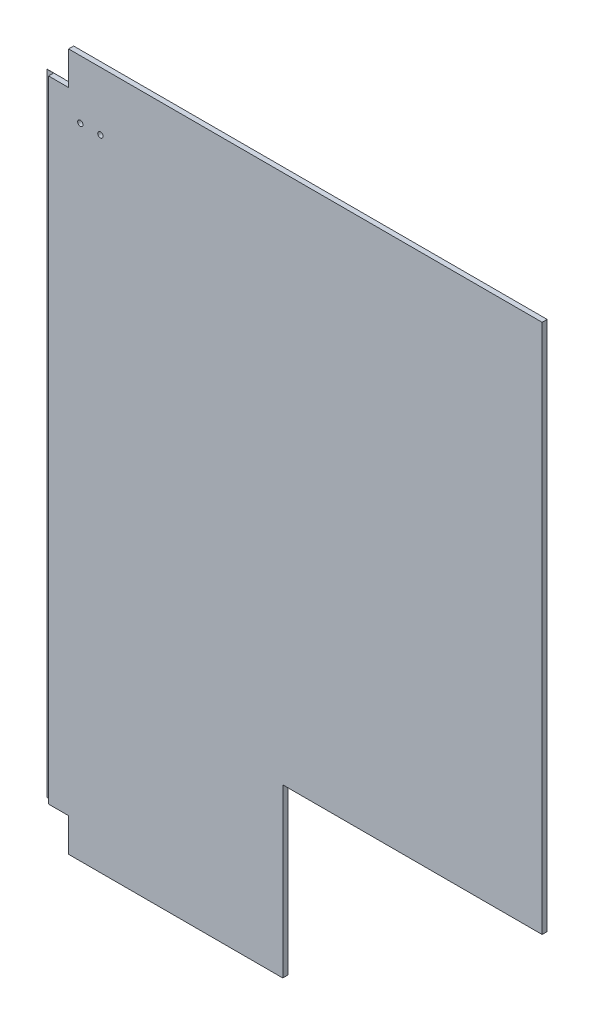
ISO-10303-21;
HEADER;
FILE_DESCRIPTION(('STEP AP214'),'2;1');
FILE_NAME('part.step','',(''),(''),'','','');
FILE_SCHEMA(('AUTOMOTIVE_DESIGN { 1 0 10303 214 1 1 1 1 }'));
ENDSEC;
DATA;
#1=APPLICATION_CONTEXT('core data for automotive mechanical design processes');
#2=APPLICATION_PROTOCOL_DEFINITION('international standard','automotive_design',2000,#1);
#3=PRODUCT_CONTEXT('',#1,'mechanical');
#4=PRODUCT('Part','Part','',(#3));
#5=PRODUCT_RELATED_PRODUCT_CATEGORY('part','',(#4));
#6=PRODUCT_DEFINITION_FORMATION('','',#4);
#7=PRODUCT_DEFINITION_CONTEXT('part definition',#1,'design');
#8=PRODUCT_DEFINITION('design','',#6,#7);
#9=PRODUCT_DEFINITION_SHAPE('','',#8);
#10=(LENGTH_UNIT() NAMED_UNIT(*) SI_UNIT(.MILLI.,.METRE.));
#11=(NAMED_UNIT(*) PLANE_ANGLE_UNIT() SI_UNIT($,.RADIAN.));
#12=(NAMED_UNIT(*) SI_UNIT($,.STERADIAN.) SOLID_ANGLE_UNIT());
#13=UNCERTAINTY_MEASURE_WITH_UNIT(LENGTH_MEASURE(1.E-05),#10,'distance_accuracy_value','');
#14=(GEOMETRIC_REPRESENTATION_CONTEXT(3) GLOBAL_UNCERTAINTY_ASSIGNED_CONTEXT((#13)) GLOBAL_UNIT_ASSIGNED_CONTEXT((#10,
#11,#12)) REPRESENTATION_CONTEXT('',''));
#15=CARTESIAN_POINT('',(0.,0.,0.));
#16=DIRECTION('',(0.,0.,1.));
#17=DIRECTION('',(1.,0.,0.));
#18=AXIS2_PLACEMENT_3D('',#15,#16,#17);
#19=CARTESIAN_POINT('',(5.99999999999989,416.9,-0.1));
#20=DIRECTION('',(1.,0.,0.));
#21=DIRECTION('',(0.,1.,0.));
#22=AXIS2_PLACEMENT_3D('',#19,#20,#21);
#23=PLANE('',#22);
#24=DIRECTION('',(0.,0.,-1.));
#25=VECTOR('',#24,1.);
#26=CARTESIAN_POINT('',(5.99999999999989,396.9,-0.1));
#27=LINE('',#26,#25);
#28=CARTESIAN_POINT('',(5.99999999999994,396.9,0.));
#29=VERTEX_POINT('',#28);
#30=CARTESIAN_POINT('',(5.99999999999989,396.9,-0.1));
#31=VERTEX_POINT('',#30);
#32=EDGE_CURVE('E109',#29,#31,#27,.T.);
#33=ORIENTED_EDGE('',*,*,#32,.F.);
#34=DIRECTION('',(0.,1.,0.));
#35=VECTOR('',#34,1.);
#36=CARTESIAN_POINT('',(5.99999999999989,416.9,0.));
#37=LINE('',#36,#35);
#38=CARTESIAN_POINT('',(5.99999999999993,20.,0.));
#39=VERTEX_POINT('',#38);
#40=EDGE_CURVE('E117',#39,#29,#37,.T.);
#41=ORIENTED_EDGE('',*,*,#40,.F.);
#42=DIRECTION('',(0.,0.,1.));
#43=VECTOR('',#42,1.);
#44=CARTESIAN_POINT('',(5.99999999999993,20.,-0.1));
#45=LINE('',#44,#43);
#46=CARTESIAN_POINT('',(5.99999999999993,20.,-0.1));
#47=VERTEX_POINT('',#46);
#48=EDGE_CURVE('E76',#47,#39,#45,.T.);
#49=ORIENTED_EDGE('',*,*,#48,.F.);
#50=DIRECTION('',(0.,1.,0.));
#51=VECTOR('',#50,1.);
#52=CARTESIAN_POINT('',(5.99999999999989,416.9,-0.1));
#53=LINE('',#52,#51);
#54=EDGE_CURVE('E108',#47,#31,#53,.T.);
#55=ORIENTED_EDGE('',*,*,#54,.T.);
#56=EDGE_LOOP('',(#33,#41,#49,#55));
#57=FACE_BOUND('',#56,.T.);
#58=ADVANCED_FACE('F55',(#57),#23,.T.);
#59=CARTESIAN_POINT('',(-4.00000000000011,416.9,-0.1));
#60=DIRECTION('',(-1.,0.,0.));
#61=DIRECTION('',(0.,-1.,0.));
#62=AXIS2_PLACEMENT_3D('',#59,#60,#61);
#63=PLANE('',#62);
#64=DIRECTION('',(0.,0.,1.));
#65=VECTOR('',#64,1.);
#66=CARTESIAN_POINT('',(-4.00000000000011,396.9,-7.));
#67=LINE('',#66,#65);
#68=CARTESIAN_POINT('',(-4.00000000000011,396.9,-0.1));
#69=VERTEX_POINT('',#68);
#70=CARTESIAN_POINT('',(-4.00000000000011,396.9,0.));
#71=VERTEX_POINT('',#70);
#72=EDGE_CURVE('E69',#69,#71,#67,.T.);
#73=ORIENTED_EDGE('',*,*,#72,.F.);
#74=DIRECTION('',(0.,-1.,0.));
#75=VECTOR('',#74,1.);
#76=CARTESIAN_POINT('',(-4.00000000000011,416.9,-0.1));
#77=LINE('',#76,#75);
#78=CARTESIAN_POINT('',(-4.00000000000006,20.,-0.1));
#79=VERTEX_POINT('',#78);
#80=EDGE_CURVE('E106',#69,#79,#77,.T.);
#81=ORIENTED_EDGE('',*,*,#80,.T.);
#82=DIRECTION('',(0.,0.,1.));
#83=VECTOR('',#82,1.);
#84=CARTESIAN_POINT('',(-4.00000000000006,20.,-7.));
#85=LINE('',#84,#83);
#86=CARTESIAN_POINT('',(-4.00000000000006,20.,0.));
#87=VERTEX_POINT('',#86);
#88=EDGE_CURVE('E92',#79,#87,#85,.T.);
#89=ORIENTED_EDGE('',*,*,#88,.T.);
#90=DIRECTION('',(0.,-1.,0.));
#91=VECTOR('',#90,1.);
#92=CARTESIAN_POINT('',(-4.00000000000011,416.9,0.));
#93=LINE('',#92,#91);
#94=EDGE_CURVE('E113',#71,#87,#93,.T.);
#95=ORIENTED_EDGE('',*,*,#94,.F.);
#96=EDGE_LOOP('',(#73,#81,#89,#95));
#97=FACE_BOUND('',#96,.T.);
#98=ADVANCED_FACE('F111',(#97),#63,.T.);
#99=CARTESIAN_POINT('',(0.,0.,-0.1));
#100=DIRECTION('',(0.,0.,-1.));
#101=DIRECTION('',(-1.,0.,0.));
#102=AXIS2_PLACEMENT_3D('',#99,#100,#101);
#103=PLANE('',#102);
#104=DIRECTION('',(-1.,0.,0.));
#105=VECTOR('',#104,1.);
#106=CARTESIAN_POINT('',(0.,396.9,-0.1));
#107=LINE('',#106,#105);
#108=EDGE_CURVE('E120',#31,#69,#107,.T.);
#109=ORIENTED_EDGE('',*,*,#108,.F.);
#110=ORIENTED_EDGE('',*,*,#54,.F.);
#111=DIRECTION('',(1.,0.,0.));
#112=VECTOR('',#111,1.);
#113=CARTESIAN_POINT('',(0.,20.,-0.1));
#114=LINE('',#113,#112);
#115=EDGE_CURVE('E95',#79,#47,#114,.T.);
#116=ORIENTED_EDGE('',*,*,#115,.F.);
#117=ORIENTED_EDGE('',*,*,#80,.F.);
#118=EDGE_LOOP('',(#109,#110,#116,#117));
#119=FACE_BOUND('',#118,.T.);
#120=ADVANCED_FACE('F105',(#119),#103,.T.);
#121=CARTESIAN_POINT('',(0.,0.,0.));
#122=DIRECTION('',(0.,0.,-1.));
#123=DIRECTION('',(-1.,0.,0.));
#124=AXIS2_PLACEMENT_3D('',#121,#122,#123);
#125=PLANE('',#124);
#126=ORIENTED_EDGE('',*,*,#40,.T.);
#127=DIRECTION('',(-1.,0.,0.));
#128=VECTOR('',#127,1.);
#129=CARTESIAN_POINT('',(0.,396.9,0.));
#130=LINE('',#129,#128);
#131=EDGE_CURVE('E12',#29,#71,#130,.T.);
#132=ORIENTED_EDGE('',*,*,#131,.T.);
#133=ORIENTED_EDGE('',*,*,#94,.T.);
#134=DIRECTION('',(1.,0.,0.));
#135=VECTOR('',#134,1.);
#136=CARTESIAN_POINT('',(0.,20.,0.));
#137=LINE('',#136,#135);
#138=EDGE_CURVE('E62',#87,#39,#137,.T.);
#139=ORIENTED_EDGE('',*,*,#138,.T.);
#140=EDGE_LOOP('',(#126,#132,#133,#139));
#141=FACE_BOUND('',#140,.T.);
#142=ADVANCED_FACE('F122',(#141),#125,.F.);
#143=CARTESIAN_POINT('',(0.,20.,-7.));
#144=DIRECTION('',(0.,1.,0.));
#145=DIRECTION('',(-1.,0.,0.));
#146=AXIS2_PLACEMENT_3D('',#143,#144,#145);
#147=PLANE('',#146);
#148=ORIENTED_EDGE('',*,*,#115,.T.);
#149=ORIENTED_EDGE('',*,*,#48,.T.);
#150=ORIENTED_EDGE('',*,*,#138,.F.);
#151=ORIENTED_EDGE('',*,*,#88,.F.);
#152=EDGE_LOOP('',(#148,#149,#150,#151));
#153=FACE_BOUND('',#152,.T.);
#154=ADVANCED_FACE('F94',(#153),#147,.F.);
#155=CARTESIAN_POINT('',(-1.0842021724855E-13,396.9,-7.));
#156=DIRECTION('',(0.,-1.,0.));
#157=DIRECTION('',(0.,0.,-1.));
#158=AXIS2_PLACEMENT_3D('',#155,#156,#157);
#159=PLANE('',#158);
#160=ORIENTED_EDGE('',*,*,#108,.T.);
#161=ORIENTED_EDGE('',*,*,#72,.T.);
#162=ORIENTED_EDGE('',*,*,#131,.F.);
#163=ORIENTED_EDGE('',*,*,#32,.T.);
#164=EDGE_LOOP('',(#160,#161,#162,#163));
#165=FACE_BOUND('',#164,.T.);
#166=ADVANCED_FACE('F125',(#165),#159,.F.);
#167=CLOSED_SHELL('',(#58,#98,#120,#142,#154,#166));
#168=MANIFOLD_SOLID_BREP('B2',#167);
#169=CARTESIAN_POINT('',(0.,0.,3.));
#170=DIRECTION('',(1.,0.,0.));
#171=DIRECTION('',(0.,1.,0.));
#172=AXIS2_PLACEMENT_3D('',#169,#170,#171);
#173=PLANE('',#172);
#174=DIRECTION('',(0.,-1.,0.));
#175=VECTOR('',#174,1.);
#176=CARTESIAN_POINT('',(0.,0.,3.));
#177=LINE('',#176,#175);
#178=CARTESIAN_POINT('',(-1.11022302462516E-13,396.9,3.));
#179=VERTEX_POINT('',#178);
#180=CARTESIAN_POINT('',(-1.11022302462516E-13,20.,3.));
#181=VERTEX_POINT('',#180);
#182=EDGE_CURVE('E300',#179,#181,#177,.T.);
#183=ORIENTED_EDGE('',*,*,#182,.F.);
#184=DIRECTION('',(0.,0.,-1.));
#185=VECTOR('',#184,1.);
#186=CARTESIAN_POINT('',(-1.05696214553544E-13,396.9,3.));
#187=LINE('',#186,#185);
#188=CARTESIAN_POINT('',(-1.11022302462516E-13,396.9,0.));
#189=VERTEX_POINT('',#188);
#190=EDGE_CURVE('E292',#179,#189,#187,.T.);
#191=ORIENTED_EDGE('',*,*,#190,.T.);
#192=DIRECTION('',(0.,-1.,0.));
#193=VECTOR('',#192,1.);
#194=CARTESIAN_POINT('',(0.,0.,0.));
#195=LINE('',#194,#193);
#196=CARTESIAN_POINT('',(-1.11022302462516E-13,20.,0.));
#197=VERTEX_POINT('',#196);
#198=EDGE_CURVE('E288',#189,#197,#195,.T.);
#199=ORIENTED_EDGE('',*,*,#198,.T.);
#200=DIRECTION('',(0.,0.,1.));
#201=VECTOR('',#200,1.);
#202=CARTESIAN_POINT('',(0.,20.,3.));
#203=LINE('',#202,#201);
#204=EDGE_CURVE('E335',#197,#181,#203,.T.);
#205=ORIENTED_EDGE('',*,*,#204,.T.);
#206=EDGE_LOOP('',(#183,#191,#199,#205));
#207=FACE_BOUND('',#206,.T.);
#208=ADVANCED_FACE('F185',(#207),#173,.F.);
#209=CARTESIAN_POINT('',(0.,0.,3.));
#210=DIRECTION('',(0.,1.,0.));
#211=DIRECTION('',(0.,0.,1.));
#212=AXIS2_PLACEMENT_3D('',#209,#210,#211);
#213=PLANE('',#212);
#214=DIRECTION('',(1.,0.,0.));
#215=VECTOR('',#214,1.);
#216=CARTESIAN_POINT('',(0.,0.,3.));
#217=LINE('',#216,#215);
#218=CARTESIAN_POINT('',(12.,0.,3.));
#219=VERTEX_POINT('',#218);
#220=CARTESIAN_POINT('',(140.,0.,3.));
#221=VERTEX_POINT('',#220);
#222=EDGE_CURVE('E350',#219,#221,#217,.T.);
#223=ORIENTED_EDGE('',*,*,#222,.F.);
#224=DIRECTION('',(0.,0.,1.));
#225=VECTOR('',#224,1.);
#226=CARTESIAN_POINT('',(12.,0.,-7.));
#227=LINE('',#226,#225);
#228=CARTESIAN_POINT('',(12.,0.,0.));
#229=VERTEX_POINT('',#228);
#230=EDGE_CURVE('E337',#229,#219,#227,.T.);
#231=ORIENTED_EDGE('',*,*,#230,.F.);
#232=DIRECTION('',(1.,0.,0.));
#233=VECTOR('',#232,1.);
#234=CARTESIAN_POINT('',(0.,0.,0.));
#235=LINE('',#234,#233);
#236=CARTESIAN_POINT('',(140.,0.,0.));
#237=VERTEX_POINT('',#236);
#238=EDGE_CURVE('E291',#229,#237,#235,.T.);
#239=ORIENTED_EDGE('',*,*,#238,.T.);
#240=DIRECTION('',(0.,0.,-1.));
#241=VECTOR('',#240,1.);
#242=CARTESIAN_POINT('',(140.,0.,3.));
#243=LINE('',#242,#241);
#244=EDGE_CURVE('E282',#221,#237,#243,.T.);
#245=ORIENTED_EDGE('',*,*,#244,.F.);
#246=EDGE_LOOP('',(#223,#231,#239,#245));
#247=FACE_BOUND('',#246,.T.);
#248=ADVANCED_FACE('F383',(#247),#213,.F.);
#249=CARTESIAN_POINT('',(140.,0.,3.));
#250=DIRECTION('',(-1.,0.,0.));
#251=DIRECTION('',(0.,0.,1.));
#252=AXIS2_PLACEMENT_3D('',#249,#250,#251);
#253=PLANE('',#252);
#254=DIRECTION('',(0.,1.,0.));
#255=VECTOR('',#254,1.);
#256=CARTESIAN_POINT('',(140.,0.,0.));
#257=LINE('',#256,#255);
#258=CARTESIAN_POINT('',(140.,100.,0.));
#259=VERTEX_POINT('',#258);
#260=EDGE_CURVE('E294',#237,#259,#257,.T.);
#261=ORIENTED_EDGE('',*,*,#260,.T.);
#262=DIRECTION('',(0.,0.,-1.));
#263=VECTOR('',#262,1.);
#264=CARTESIAN_POINT('',(140.,100.,3.));
#265=LINE('',#264,#263);
#266=CARTESIAN_POINT('',(140.,100.,3.));
#267=VERTEX_POINT('',#266);
#268=EDGE_CURVE('E279',#267,#259,#265,.T.);
#269=ORIENTED_EDGE('',*,*,#268,.F.);
#270=DIRECTION('',(0.,1.,0.));
#271=VECTOR('',#270,1.);
#272=CARTESIAN_POINT('',(140.,0.,3.));
#273=LINE('',#272,#271);
#274=EDGE_CURVE('E284',#221,#267,#273,.T.);
#275=ORIENTED_EDGE('',*,*,#274,.F.);
#276=ORIENTED_EDGE('',*,*,#244,.T.);
#277=EDGE_LOOP('',(#261,#269,#275,#276));
#278=FACE_BOUND('',#277,.T.);
#279=ADVANCED_FACE('F357',(#278),#253,.F.);
#280=CARTESIAN_POINT('',(300.,100.,3.));
#281=DIRECTION('',(0.,1.,0.));
#282=DIRECTION('',(-1.,0.,0.));
#283=AXIS2_PLACEMENT_3D('',#280,#281,#282);
#284=PLANE('',#283);
#285=DIRECTION('',(1.,0.,0.));
#286=VECTOR('',#285,1.);
#287=CARTESIAN_POINT('',(300.,100.,0.));
#288=LINE('',#287,#286);
#289=CARTESIAN_POINT('',(295.,100.,0.));
#290=VERTEX_POINT('',#289);
#291=EDGE_CURVE('E296',#259,#290,#288,.T.);
#292=ORIENTED_EDGE('',*,*,#291,.T.);
#293=DIRECTION('',(0.,0.,1.));
#294=VECTOR('',#293,1.);
#295=CARTESIAN_POINT('',(295.,100.,-7.));
#296=LINE('',#295,#294);
#297=CARTESIAN_POINT('',(295.,100.,3.));
#298=VERTEX_POINT('',#297);
#299=EDGE_CURVE('E198',#290,#298,#296,.T.);
#300=ORIENTED_EDGE('',*,*,#299,.T.);
#301=DIRECTION('',(1.,0.,0.));
#302=VECTOR('',#301,1.);
#303=CARTESIAN_POINT('',(300.,100.,3.));
#304=LINE('',#303,#302);
#305=EDGE_CURVE('E273',#267,#298,#304,.T.);
#306=ORIENTED_EDGE('',*,*,#305,.F.);
#307=ORIENTED_EDGE('',*,*,#268,.T.);
#308=EDGE_LOOP('',(#292,#300,#306,#307));
#309=FACE_BOUND('',#308,.T.);
#310=ADVANCED_FACE('F361',(#309),#284,.F.);
#311=CARTESIAN_POINT('',(-1.11022302462516E-13,416.9,3.));
#312=DIRECTION('',(0.,-1.,0.));
#313=DIRECTION('',(0.,0.,-1.));
#314=AXIS2_PLACEMENT_3D('',#311,#312,#313);
#315=PLANE('',#314);
#316=DIRECTION('',(-1.,0.,0.));
#317=VECTOR('',#316,1.);
#318=CARTESIAN_POINT('',(-1.11022302462516E-13,416.9,3.));
#319=LINE('',#318,#317);
#320=CARTESIAN_POINT('',(295.,416.9,3.));
#321=VERTEX_POINT('',#320);
#322=CARTESIAN_POINT('',(11.9999999999999,416.9,3.));
#323=VERTEX_POINT('',#322);
#324=EDGE_CURVE('E270',#321,#323,#319,.T.);
#325=ORIENTED_EDGE('',*,*,#324,.F.);
#326=DIRECTION('',(0.,0.,1.));
#327=VECTOR('',#326,1.);
#328=CARTESIAN_POINT('',(295.,416.9,-7.));
#329=LINE('',#328,#327);
#330=CARTESIAN_POINT('',(295.,416.9,0.));
#331=VERTEX_POINT('',#330);
#332=EDGE_CURVE('E258',#331,#321,#329,.T.);
#333=ORIENTED_EDGE('',*,*,#332,.F.);
#334=DIRECTION('',(-1.,0.,0.));
#335=VECTOR('',#334,1.);
#336=CARTESIAN_POINT('',(-1.11022302462516E-13,416.9,0.));
#337=LINE('',#336,#335);
#338=CARTESIAN_POINT('',(11.9999999999999,416.9,0.));
#339=VERTEX_POINT('',#338);
#340=EDGE_CURVE('E299',#331,#339,#337,.T.);
#341=ORIENTED_EDGE('',*,*,#340,.T.);
#342=DIRECTION('',(0.,0.,1.));
#343=VECTOR('',#342,1.);
#344=CARTESIAN_POINT('',(11.9999999999999,416.9,-7.));
#345=LINE('',#344,#343);
#346=EDGE_CURVE('E278',#339,#323,#345,.T.);
#347=ORIENTED_EDGE('',*,*,#346,.T.);
#348=EDGE_LOOP('',(#325,#333,#341,#347));
#349=FACE_BOUND('',#348,.T.);
#350=ADVANCED_FACE('F276',(#349),#315,.F.);
#351=CARTESIAN_POINT('',(0.,0.,3.));
#352=DIRECTION('',(0.,0.,-1.));
#353=DIRECTION('',(-1.,0.,0.));
#354=AXIS2_PLACEMENT_3D('',#351,#352,#353);
#355=PLANE('',#354);
#356=CARTESIAN_POINT('',(18.9999999999999,381.9,3.));
#357=DIRECTION('',(0.,0.,1.));
#358=DIRECTION('',(1.,0.,0.));
#359=AXIS2_PLACEMENT_3D('',#356,#357,#358);
#360=CIRCLE('',#359,1.59999999999999);
#361=CARTESIAN_POINT('',(20.5999999999999,381.9,3.));
#362=VERTEX_POINT('',#361);
#363=EDGE_CURVE('E318',#362,#362,#360,.T.);
#364=ORIENTED_EDGE('',*,*,#363,.F.);
#365=EDGE_LOOP('',(#364));
#366=FACE_BOUND('',#365,.T.);
#367=CARTESIAN_POINT('',(30.9999999999999,381.9,3.));
#368=DIRECTION('',(0.,0.,1.));
#369=DIRECTION('',(1.,0.,0.));
#370=AXIS2_PLACEMENT_3D('',#367,#368,#369);
#371=CIRCLE('',#370,1.59999999999999);
#372=CARTESIAN_POINT('',(32.5999999999999,381.9,3.));
#373=VERTEX_POINT('',#372);
#374=EDGE_CURVE('E315',#373,#373,#371,.T.);
#375=ORIENTED_EDGE('',*,*,#374,.F.);
#376=EDGE_LOOP('',(#375));
#377=FACE_BOUND('',#376,.T.);
#378=ORIENTED_EDGE('',*,*,#305,.T.);
#379=DIRECTION('',(0.,-1.,0.));
#380=VECTOR('',#379,1.);
#381=CARTESIAN_POINT('',(295.,416.9,3.));
#382=LINE('',#381,#380);
#383=EDGE_CURVE('E261',#321,#298,#382,.T.);
#384=ORIENTED_EDGE('',*,*,#383,.F.);
#385=ORIENTED_EDGE('',*,*,#324,.T.);
#386=DIRECTION('',(0.,1.,0.));
#387=VECTOR('',#386,1.);
#388=CARTESIAN_POINT('',(11.9999999999999,416.9,3.));
#389=LINE('',#388,#387);
#390=CARTESIAN_POINT('',(11.9999999999999,396.9,3.));
#391=VERTEX_POINT('',#390);
#392=EDGE_CURVE('E331',#391,#323,#389,.T.);
#393=ORIENTED_EDGE('',*,*,#392,.F.);
#394=DIRECTION('',(1.,0.,0.));
#395=VECTOR('',#394,1.);
#396=CARTESIAN_POINT('',(-1.0842021724855E-13,396.9,3.));
#397=LINE('',#396,#395);
#398=EDGE_CURVE('E329',#179,#391,#397,.T.);
#399=ORIENTED_EDGE('',*,*,#398,.F.);
#400=ORIENTED_EDGE('',*,*,#182,.T.);
#401=DIRECTION('',(-1.,0.,0.));
#402=VECTOR('',#401,1.);
#403=CARTESIAN_POINT('',(0.,20.,3.));
#404=LINE('',#403,#402);
#405=CARTESIAN_POINT('',(12.,20.,3.));
#406=VERTEX_POINT('',#405);
#407=EDGE_CURVE('E339',#406,#181,#404,.T.);
#408=ORIENTED_EDGE('',*,*,#407,.F.);
#409=DIRECTION('',(0.,1.,0.));
#410=VECTOR('',#409,1.);
#411=CARTESIAN_POINT('',(12.,0.,3.));
#412=LINE('',#411,#410);
#413=EDGE_CURVE('E332',#219,#406,#412,.T.);
#414=ORIENTED_EDGE('',*,*,#413,.F.);
#415=ORIENTED_EDGE('',*,*,#222,.T.);
#416=ORIENTED_EDGE('',*,*,#274,.T.);
#417=EDGE_LOOP('',(#378,#384,#385,#393,#399,#400,#408,#414,#415,#416));
#418=FACE_BOUND('',#417,.T.);
#419=ADVANCED_FACE('F268',(#366,#377,#418),#355,.F.);
#420=CARTESIAN_POINT('',(0.,0.,0.));
#421=DIRECTION('',(0.,0.,-1.));
#422=DIRECTION('',(-1.,0.,0.));
#423=AXIS2_PLACEMENT_3D('',#420,#421,#422);
#424=PLANE('',#423);
#425=DIRECTION('',(0.,1.,0.));
#426=VECTOR('',#425,1.);
#427=CARTESIAN_POINT('',(295.,0.,0.));
#428=LINE('',#427,#426);
#429=EDGE_CURVE('E53',#290,#331,#428,.T.);
#430=ORIENTED_EDGE('',*,*,#429,.F.);
#431=ORIENTED_EDGE('',*,*,#291,.F.);
#432=ORIENTED_EDGE('',*,*,#260,.F.);
#433=ORIENTED_EDGE('',*,*,#238,.F.);
#434=DIRECTION('',(0.,-1.,0.));
#435=VECTOR('',#434,1.);
#436=CARTESIAN_POINT('',(12.,0.,0.));
#437=LINE('',#436,#435);
#438=CARTESIAN_POINT('',(12.,20.,0.));
#439=VERTEX_POINT('',#438);
#440=EDGE_CURVE('E304',#439,#229,#437,.T.);
#441=ORIENTED_EDGE('',*,*,#440,.F.);
#442=DIRECTION('',(1.,0.,0.));
#443=VECTOR('',#442,1.);
#444=CARTESIAN_POINT('',(0.,20.,0.));
#445=LINE('',#444,#443);
#446=EDGE_CURVE('E306',#197,#439,#445,.T.);
#447=ORIENTED_EDGE('',*,*,#446,.F.);
#448=ORIENTED_EDGE('',*,*,#198,.F.);
#449=DIRECTION('',(-1.,0.,0.));
#450=VECTOR('',#449,1.);
#451=CARTESIAN_POINT('',(0.,396.9,0.));
#452=LINE('',#451,#450);
#453=CARTESIAN_POINT('',(11.9999999999999,396.9,0.));
#454=VERTEX_POINT('',#453);
#455=EDGE_CURVE('E309',#454,#189,#452,.T.);
#456=ORIENTED_EDGE('',*,*,#455,.F.);
#457=DIRECTION('',(0.,-1.,0.));
#458=VECTOR('',#457,1.);
#459=CARTESIAN_POINT('',(11.9999999999999,0.,0.));
#460=LINE('',#459,#458);
#461=EDGE_CURVE('E192',#339,#454,#460,.T.);
#462=ORIENTED_EDGE('',*,*,#461,.F.);
#463=ORIENTED_EDGE('',*,*,#340,.F.);
#464=EDGE_LOOP('',(#430,#431,#432,#433,#441,#447,#448,#456,#462,#463));
#465=FACE_BOUND('',#464,.T.);
#466=CARTESIAN_POINT('',(18.9999999999999,381.9,0.));
#467=DIRECTION('',(0.,0.,-1.));
#468=DIRECTION('',(-1.,0.,0.));
#469=AXIS2_PLACEMENT_3D('',#466,#467,#468);
#470=CIRCLE('',#469,1.59999999999999);
#471=CARTESIAN_POINT('',(17.3999999999999,381.9,0.));
#472=VERTEX_POINT('',#471);
#473=EDGE_CURVE('E316',#472,#472,#470,.T.);
#474=ORIENTED_EDGE('',*,*,#473,.F.);
#475=EDGE_LOOP('',(#474));
#476=FACE_BOUND('',#475,.T.);
#477=CARTESIAN_POINT('',(30.9999999999999,381.9,0.));
#478=DIRECTION('',(0.,0.,-1.));
#479=DIRECTION('',(-1.,0.,0.));
#480=AXIS2_PLACEMENT_3D('',#477,#478,#479);
#481=CIRCLE('',#480,1.59999999999999);
#482=CARTESIAN_POINT('',(29.3999999999999,381.9,0.));
#483=VERTEX_POINT('',#482);
#484=EDGE_CURVE('E312',#483,#483,#481,.T.);
#485=ORIENTED_EDGE('',*,*,#484,.F.);
#486=EDGE_LOOP('',(#485));
#487=FACE_BOUND('',#486,.T.);
#488=ADVANCED_FACE('F363',(#465,#476,#487),#424,.T.);
#489=CARTESIAN_POINT('',(0.,20.,-7.));
#490=DIRECTION('',(0.,1.,0.));
#491=DIRECTION('',(-1.,0.,0.));
#492=AXIS2_PLACEMENT_3D('',#489,#490,#491);
#493=PLANE('',#492);
#494=ORIENTED_EDGE('',*,*,#446,.T.);
#495=DIRECTION('',(0.,0.,1.));
#496=VECTOR('',#495,1.);
#497=CARTESIAN_POINT('',(12.,20.,-7.));
#498=LINE('',#497,#496);
#499=EDGE_CURVE('E314',#439,#406,#498,.T.);
#500=ORIENTED_EDGE('',*,*,#499,.T.);
#501=ORIENTED_EDGE('',*,*,#407,.T.);
#502=ORIENTED_EDGE('',*,*,#204,.F.);
#503=EDGE_LOOP('',(#494,#500,#501,#502));
#504=FACE_BOUND('',#503,.T.);
#505=ADVANCED_FACE('F377',(#504),#493,.F.);
#506=CARTESIAN_POINT('',(12.,0.,-7.));
#507=DIRECTION('',(1.,0.,0.));
#508=DIRECTION('',(0.,1.,0.));
#509=AXIS2_PLACEMENT_3D('',#506,#507,#508);
#510=PLANE('',#509);
#511=ORIENTED_EDGE('',*,*,#440,.T.);
#512=ORIENTED_EDGE('',*,*,#230,.T.);
#513=ORIENTED_EDGE('',*,*,#413,.T.);
#514=ORIENTED_EDGE('',*,*,#499,.F.);
#515=EDGE_LOOP('',(#511,#512,#513,#514));
#516=FACE_BOUND('',#515,.T.);
#517=ADVANCED_FACE('F381',(#516),#510,.F.);
#518=CARTESIAN_POINT('',(-1.0842021724855E-13,396.9,-7.));
#519=DIRECTION('',(0.,-1.,0.));
#520=DIRECTION('',(0.,0.,-1.));
#521=AXIS2_PLACEMENT_3D('',#518,#519,#520);
#522=PLANE('',#521);
#523=ORIENTED_EDGE('',*,*,#398,.T.);
#524=DIRECTION('',(0.,0.,1.));
#525=VECTOR('',#524,1.);
#526=CARTESIAN_POINT('',(11.9999999999999,396.9,-7.));
#527=LINE('',#526,#525);
#528=EDGE_CURVE('E206',#454,#391,#527,.T.);
#529=ORIENTED_EDGE('',*,*,#528,.F.);
#530=ORIENTED_EDGE('',*,*,#455,.T.);
#531=ORIENTED_EDGE('',*,*,#190,.F.);
#532=EDGE_LOOP('',(#523,#529,#530,#531));
#533=FACE_BOUND('',#532,.T.);
#534=ADVANCED_FACE('F404',(#533),#522,.F.);
#535=CARTESIAN_POINT('',(11.9999999999999,416.9,-7.));
#536=DIRECTION('',(1.,0.,0.));
#537=DIRECTION('',(0.,0.,-1.));
#538=AXIS2_PLACEMENT_3D('',#535,#536,#537);
#539=PLANE('',#538);
#540=ORIENTED_EDGE('',*,*,#461,.T.);
#541=ORIENTED_EDGE('',*,*,#528,.T.);
#542=ORIENTED_EDGE('',*,*,#392,.T.);
#543=ORIENTED_EDGE('',*,*,#346,.F.);
#544=EDGE_LOOP('',(#540,#541,#542,#543));
#545=FACE_BOUND('',#544,.T.);
#546=ADVANCED_FACE('F369',(#545),#539,.F.);
#547=CARTESIAN_POINT('',(30.9999999999999,381.9,3.));
#548=DIRECTION('',(0.,0.,1.));
#549=DIRECTION('',(1.,0.,0.));
#550=AXIS2_PLACEMENT_3D('',#547,#548,#549);
#551=CYLINDRICAL_SURFACE('',#550,1.59999999999999);
#552=ORIENTED_EDGE('',*,*,#484,.T.);
#553=EDGE_LOOP('',(#552));
#554=FACE_BOUND('',#553,.T.);
#555=ORIENTED_EDGE('',*,*,#374,.T.);
#556=EDGE_LOOP('',(#555));
#557=FACE_BOUND('',#556,.T.);
#558=ADVANCED_FACE('F409',(#554,#557),#551,.F.);
#559=CARTESIAN_POINT('',(18.9999999999999,381.9,3.));
#560=DIRECTION('',(0.,0.,1.));
#561=DIRECTION('',(1.,0.,0.));
#562=AXIS2_PLACEMENT_3D('',#559,#560,#561);
#563=CYLINDRICAL_SURFACE('',#562,1.59999999999999);
#564=ORIENTED_EDGE('',*,*,#473,.T.);
#565=EDGE_LOOP('',(#564));
#566=FACE_BOUND('',#565,.T.);
#567=ORIENTED_EDGE('',*,*,#363,.T.);
#568=EDGE_LOOP('',(#567));
#569=FACE_BOUND('',#568,.T.);
#570=ADVANCED_FACE('F412',(#566,#569),#563,.F.);
#571=CARTESIAN_POINT('',(295.,416.9,-7.));
#572=DIRECTION('',(-1.,0.,0.));
#573=DIRECTION('',(0.,-1.,0.));
#574=AXIS2_PLACEMENT_3D('',#571,#572,#573);
#575=PLANE('',#574);
#576=ORIENTED_EDGE('',*,*,#429,.T.);
#577=ORIENTED_EDGE('',*,*,#332,.T.);
#578=ORIENTED_EDGE('',*,*,#383,.T.);
#579=ORIENTED_EDGE('',*,*,#299,.F.);
#580=EDGE_LOOP('',(#576,#577,#578,#579));
#581=FACE_BOUND('',#580,.T.);
#582=ADVANCED_FACE('F260',(#581),#575,.F.);
#583=CLOSED_SHELL('',(#208,#248,#279,#310,#350,#419,#488,#505,#517,#534,#546,#558,#570,#582));
#584=MANIFOLD_SOLID_BREP('B6',#583);
#585=ADVANCED_BREP_SHAPE_REPRESENTATION('',(#18,#168,#584),#14);
#586=SHAPE_DEFINITION_REPRESENTATION(#9,#585);
ENDSEC;
END-ISO-10303-21;
